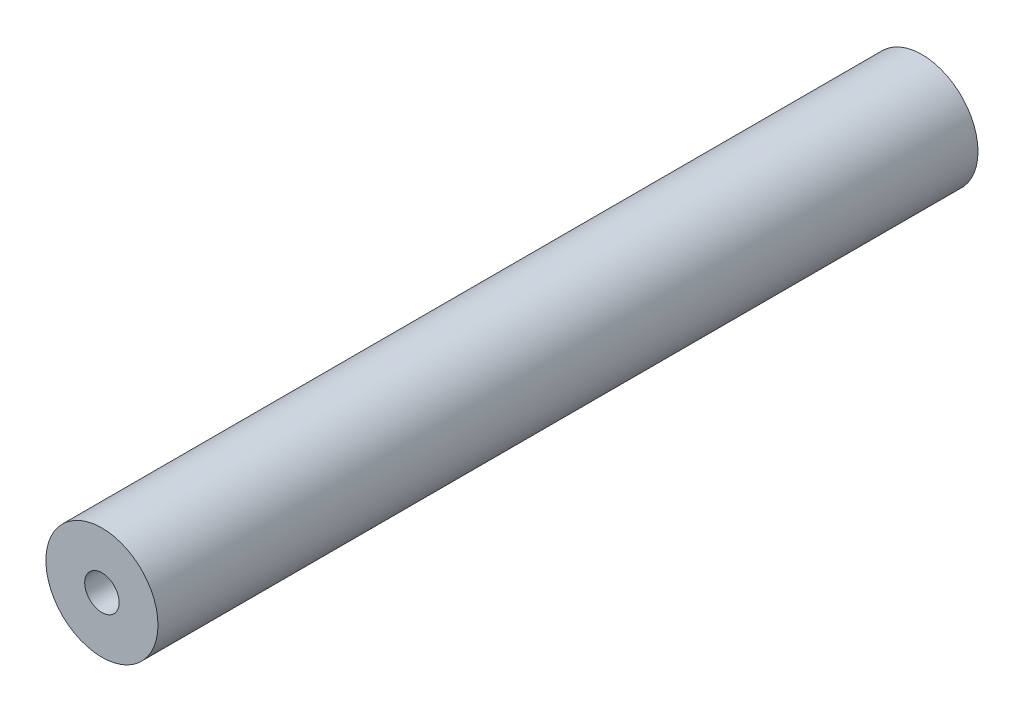
ISO-10303-21;
HEADER;
FILE_DESCRIPTION(('STEP AP214'),'2;1');
FILE_NAME('part.step','',(''),(''),'','','');
FILE_SCHEMA(('AUTOMOTIVE_DESIGN { 1 0 10303 214 1 1 1 1 }'));
ENDSEC;
DATA;
#1=APPLICATION_CONTEXT('core data for automotive mechanical design processes');
#2=APPLICATION_PROTOCOL_DEFINITION('international standard','automotive_design',2000,#1);
#3=PRODUCT_CONTEXT('',#1,'mechanical');
#4=PRODUCT('Part','Part','',(#3));
#5=PRODUCT_RELATED_PRODUCT_CATEGORY('part','',(#4));
#6=PRODUCT_DEFINITION_FORMATION('','',#4);
#7=PRODUCT_DEFINITION_CONTEXT('part definition',#1,'design');
#8=PRODUCT_DEFINITION('design','',#6,#7);
#9=PRODUCT_DEFINITION_SHAPE('','',#8);
#10=(LENGTH_UNIT() NAMED_UNIT(*) SI_UNIT(.MILLI.,.METRE.));
#11=(NAMED_UNIT(*) PLANE_ANGLE_UNIT() SI_UNIT($,.RADIAN.));
#12=(NAMED_UNIT(*) SI_UNIT($,.STERADIAN.) SOLID_ANGLE_UNIT());
#13=UNCERTAINTY_MEASURE_WITH_UNIT(LENGTH_MEASURE(1.E-05),#10,'distance_accuracy_value','');
#14=(GEOMETRIC_REPRESENTATION_CONTEXT(3) GLOBAL_UNCERTAINTY_ASSIGNED_CONTEXT((#13)) GLOBAL_UNIT_ASSIGNED_CONTEXT((#10,
#11,#12)) REPRESENTATION_CONTEXT('',''));
#15=CARTESIAN_POINT('',(0.,0.,0.));
#16=DIRECTION('',(0.,0.,1.));
#17=DIRECTION('',(1.,0.,0.));
#18=AXIS2_PLACEMENT_3D('',#15,#16,#17);
#19=CARTESIAN_POINT('',(0.,0.,30.));
#20=DIRECTION('',(0.,0.,1.));
#21=DIRECTION('',(1.,0.,0.));
#22=AXIS2_PLACEMENT_3D('',#19,#20,#21);
#23=PLANE('',#22);
#24=CARTESIAN_POINT('',(0.,0.,30.));
#25=DIRECTION('',(0.,0.,1.));
#26=DIRECTION('',(1.,0.,0.));
#27=AXIS2_PLACEMENT_3D('',#24,#25,#26);
#28=CIRCLE('',#27,2.05);
#29=CARTESIAN_POINT('',(2.05,0.,30.));
#30=VERTEX_POINT('',#29);
#31=EDGE_CURVE('E10',#30,#30,#28,.T.);
#32=ORIENTED_EDGE('',*,*,#31,.T.);
#33=EDGE_LOOP('',(#32));
#34=FACE_BOUND('',#33,.T.);
#35=CARTESIAN_POINT('',(0.,0.,30.));
#36=DIRECTION('',(0.,0.,1.));
#37=DIRECTION('',(1.,0.,0.));
#38=AXIS2_PLACEMENT_3D('',#35,#36,#37);
#39=CIRCLE('',#38,0.63);
#40=CARTESIAN_POINT('',(0.63,0.,30.));
#41=VERTEX_POINT('',#40);
#42=EDGE_CURVE('E42',#41,#41,#39,.T.);
#43=ORIENTED_EDGE('',*,*,#42,.F.);
#44=EDGE_LOOP('',(#43));
#45=FACE_BOUND('',#44,.T.);
#46=ADVANCED_FACE('F31',(#34,#45),#23,.T.);
#47=CARTESIAN_POINT('',(0.,0.,0.));
#48=DIRECTION('',(0.,0.,1.));
#49=DIRECTION('',(1.,0.,0.));
#50=AXIS2_PLACEMENT_3D('',#47,#48,#49);
#51=PLANE('',#50);
#52=CARTESIAN_POINT('',(0.,0.,0.));
#53=DIRECTION('',(0.,0.,1.));
#54=DIRECTION('',(1.,0.,0.));
#55=AXIS2_PLACEMENT_3D('',#52,#53,#54);
#56=CIRCLE('',#55,2.05);
#57=CARTESIAN_POINT('',(2.05,0.,0.));
#58=VERTEX_POINT('',#57);
#59=EDGE_CURVE('E35',#58,#58,#56,.T.);
#60=ORIENTED_EDGE('',*,*,#59,.F.);
#61=EDGE_LOOP('',(#60));
#62=FACE_BOUND('',#61,.T.);
#63=CARTESIAN_POINT('',(0.,0.,0.));
#64=DIRECTION('',(0.,0.,1.));
#65=DIRECTION('',(1.,0.,0.));
#66=AXIS2_PLACEMENT_3D('',#63,#64,#65);
#67=CIRCLE('',#66,0.63);
#68=CARTESIAN_POINT('',(0.63,0.,0.));
#69=VERTEX_POINT('',#68);
#70=EDGE_CURVE('E44',#69,#69,#67,.T.);
#71=ORIENTED_EDGE('',*,*,#70,.T.);
#72=EDGE_LOOP('',(#71));
#73=FACE_BOUND('',#72,.T.);
#74=ADVANCED_FACE('F54',(#62,#73),#51,.F.);
#75=CARTESIAN_POINT('',(0.,0.,30.));
#76=DIRECTION('',(0.,0.,-1.));
#77=DIRECTION('',(-1.,0.,0.));
#78=AXIS2_PLACEMENT_3D('',#75,#76,#77);
#79=CYLINDRICAL_SURFACE('',#78,2.05);
#80=ORIENTED_EDGE('',*,*,#31,.F.);
#81=EDGE_LOOP('',(#80));
#82=FACE_BOUND('',#81,.T.);
#83=ORIENTED_EDGE('',*,*,#59,.T.);
#84=EDGE_LOOP('',(#83));
#85=FACE_BOUND('',#84,.T.);
#86=ADVANCED_FACE('F33',(#82,#85),#79,.T.);
#87=CARTESIAN_POINT('',(0.,0.,30.));
#88=DIRECTION('',(0.,0.,-1.));
#89=DIRECTION('',(-1.,0.,0.));
#90=AXIS2_PLACEMENT_3D('',#87,#88,#89);
#91=CYLINDRICAL_SURFACE('',#90,0.63);
#92=ORIENTED_EDGE('',*,*,#42,.T.);
#93=EDGE_LOOP('',(#92));
#94=FACE_BOUND('',#93,.T.);
#95=ORIENTED_EDGE('',*,*,#70,.F.);
#96=EDGE_LOOP('',(#95));
#97=FACE_BOUND('',#96,.T.);
#98=ADVANCED_FACE('F50',(#94,#97),#91,.F.);
#99=CLOSED_SHELL('',(#46,#74,#86,#98));
#100=MANIFOLD_SOLID_BREP('B2',#99);
#101=ADVANCED_BREP_SHAPE_REPRESENTATION('',(#18,#100),#14);
#102=SHAPE_DEFINITION_REPRESENTATION(#9,#101);
ENDSEC;
END-ISO-10303-21;
